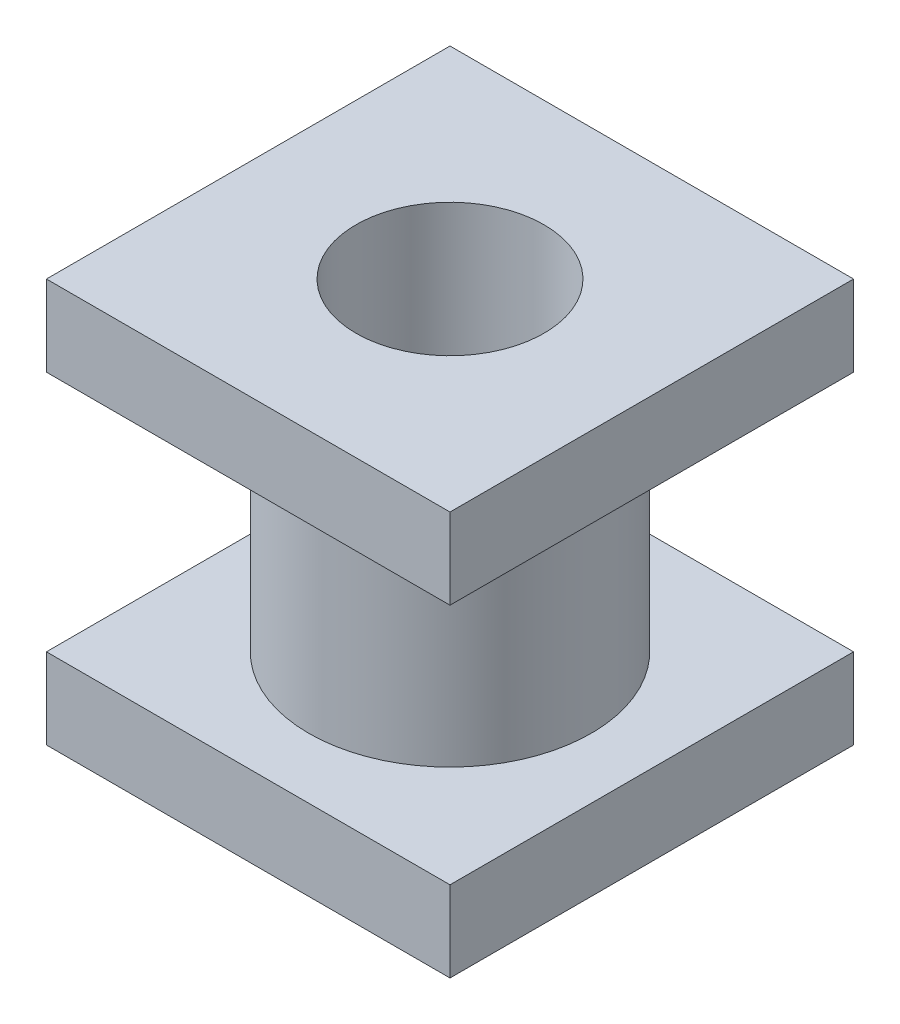
ISO-10303-21;
HEADER;
FILE_DESCRIPTION(('STEP AP214'),'2;1');
FILE_NAME('part.step','',(''),(''),'','','');
FILE_SCHEMA(('AUTOMOTIVE_DESIGN { 1 0 10303 214 1 1 1 1 }'));
ENDSEC;
DATA;
#1=APPLICATION_CONTEXT('core data for automotive mechanical design processes');
#2=APPLICATION_PROTOCOL_DEFINITION('international standard','automotive_design',2000,#1);
#3=PRODUCT_CONTEXT('',#1,'mechanical');
#4=PRODUCT('Part','Part','',(#3));
#5=PRODUCT_RELATED_PRODUCT_CATEGORY('part','',(#4));
#6=PRODUCT_DEFINITION_FORMATION('','',#4);
#7=PRODUCT_DEFINITION_CONTEXT('part definition',#1,'design');
#8=PRODUCT_DEFINITION('design','',#6,#7);
#9=PRODUCT_DEFINITION_SHAPE('','',#8);
#10=(LENGTH_UNIT() NAMED_UNIT(*) SI_UNIT(.MILLI.,.METRE.));
#11=(NAMED_UNIT(*) PLANE_ANGLE_UNIT() SI_UNIT($,.RADIAN.));
#12=(NAMED_UNIT(*) SI_UNIT($,.STERADIAN.) SOLID_ANGLE_UNIT());
#13=UNCERTAINTY_MEASURE_WITH_UNIT(LENGTH_MEASURE(1.E-05),#10,'distance_accuracy_value','');
#14=(GEOMETRIC_REPRESENTATION_CONTEXT(3) GLOBAL_UNCERTAINTY_ASSIGNED_CONTEXT((#13)) GLOBAL_UNIT_ASSIGNED_CONTEXT((#10,
#11,#12)) REPRESENTATION_CONTEXT('',''));
#15=CARTESIAN_POINT('',(0.,0.,0.));
#16=DIRECTION('',(0.,0.,1.));
#17=DIRECTION('',(1.,0.,0.));
#18=AXIS2_PLACEMENT_3D('',#15,#16,#17);
#19=CARTESIAN_POINT('',(0.,2.,0.));
#20=DIRECTION('',(0.,1.,0.));
#21=DIRECTION('',(0.,0.,1.));
#22=AXIS2_PLACEMENT_3D('',#19,#20,#21);
#23=PLANE('',#22);
#24=DIRECTION('',(0.,0.,1.));
#25=VECTOR('',#24,1.);
#26=CARTESIAN_POINT('',(0.,2.,0.));
#27=LINE('',#26,#25);
#28=CARTESIAN_POINT('',(0.,2.,0.));
#29=VERTEX_POINT('',#28);
#30=CARTESIAN_POINT('',(0.,2.,10.));
#31=VERTEX_POINT('',#30);
#32=EDGE_CURVE('E168',#29,#31,#27,.T.);
#33=ORIENTED_EDGE('',*,*,#32,.T.);
#34=DIRECTION('',(1.,0.,0.));
#35=VECTOR('',#34,1.);
#36=CARTESIAN_POINT('',(0.,2.,10.));
#37=LINE('',#36,#35);
#38=CARTESIAN_POINT('',(10.,2.,10.));
#39=VERTEX_POINT('',#38);
#40=EDGE_CURVE('E100',#31,#39,#37,.T.);
#41=ORIENTED_EDGE('',*,*,#40,.T.);
#42=DIRECTION('',(0.,0.,-1.));
#43=VECTOR('',#42,1.);
#44=CARTESIAN_POINT('',(10.,2.,0.));
#45=LINE('',#44,#43);
#46=CARTESIAN_POINT('',(10.,2.,0.));
#47=VERTEX_POINT('',#46);
#48=EDGE_CURVE('E173',#39,#47,#45,.T.);
#49=ORIENTED_EDGE('',*,*,#48,.T.);
#50=DIRECTION('',(-1.,0.,0.));
#51=VECTOR('',#50,1.);
#52=CARTESIAN_POINT('',(0.,2.,0.));
#53=LINE('',#52,#51);
#54=EDGE_CURVE('E69',#47,#29,#53,.T.);
#55=ORIENTED_EDGE('',*,*,#54,.T.);
#56=EDGE_LOOP('',(#33,#41,#49,#55));
#57=FACE_BOUND('',#56,.T.);
#58=CARTESIAN_POINT('',(5.,2.,5.));
#59=DIRECTION('',(0.,1.,0.));
#60=DIRECTION('',(0.,0.,1.));
#61=AXIS2_PLACEMENT_3D('',#58,#59,#60);
#62=CIRCLE('',#61,3.5);
#63=CARTESIAN_POINT('',(5.,2.,8.5));
#64=VERTEX_POINT('',#63);
#65=EDGE_CURVE('E155',#64,#64,#62,.T.);
#66=ORIENTED_EDGE('',*,*,#65,.F.);
#67=EDGE_LOOP('',(#66));
#68=FACE_BOUND('',#67,.T.);
#69=ADVANCED_FACE('F51',(#57,#68),#23,.T.);
#70=CARTESIAN_POINT('',(0.,0.,0.));
#71=DIRECTION('',(0.,1.,0.));
#72=DIRECTION('',(0.,0.,1.));
#73=AXIS2_PLACEMENT_3D('',#70,#71,#72);
#74=PLANE('',#73);
#75=CARTESIAN_POINT('',(5.,0.,5.));
#76=DIRECTION('',(0.,1.,0.));
#77=DIRECTION('',(0.,0.,1.));
#78=AXIS2_PLACEMENT_3D('',#75,#76,#77);
#79=CIRCLE('',#78,2.33044668672168);
#80=CARTESIAN_POINT('',(5.,0.,7.33044668672168));
#81=VERTEX_POINT('',#80);
#82=EDGE_CURVE('E252',#81,#81,#79,.T.);
#83=ORIENTED_EDGE('',*,*,#82,.T.);
#84=EDGE_LOOP('',(#83));
#85=FACE_BOUND('',#84,.T.);
#86=DIRECTION('',(0.,0.,1.));
#87=VECTOR('',#86,1.);
#88=CARTESIAN_POINT('',(0.,0.,0.));
#89=LINE('',#88,#87);
#90=CARTESIAN_POINT('',(0.,0.,0.));
#91=VERTEX_POINT('',#90);
#92=CARTESIAN_POINT('',(0.,0.,10.));
#93=VERTEX_POINT('',#92);
#94=EDGE_CURVE('E161',#91,#93,#89,.T.);
#95=ORIENTED_EDGE('',*,*,#94,.F.);
#96=DIRECTION('',(-1.,0.,0.));
#97=VECTOR('',#96,1.);
#98=CARTESIAN_POINT('',(0.,0.,0.));
#99=LINE('',#98,#97);
#100=CARTESIAN_POINT('',(10.,0.,0.));
#101=VERTEX_POINT('',#100);
#102=EDGE_CURVE('E93',#101,#91,#99,.T.);
#103=ORIENTED_EDGE('',*,*,#102,.F.);
#104=DIRECTION('',(0.,0.,-1.));
#105=VECTOR('',#104,1.);
#106=CARTESIAN_POINT('',(10.,0.,0.));
#107=LINE('',#106,#105);
#108=CARTESIAN_POINT('',(10.,0.,10.));
#109=VERTEX_POINT('',#108);
#110=EDGE_CURVE('E87',#109,#101,#107,.T.);
#111=ORIENTED_EDGE('',*,*,#110,.F.);
#112=DIRECTION('',(1.,0.,0.));
#113=VECTOR('',#112,1.);
#114=CARTESIAN_POINT('',(0.,0.,10.));
#115=LINE('',#114,#113);
#116=EDGE_CURVE('E182',#93,#109,#115,.T.);
#117=ORIENTED_EDGE('',*,*,#116,.F.);
#118=EDGE_LOOP('',(#95,#103,#111,#117));
#119=FACE_BOUND('',#118,.T.);
#120=ADVANCED_FACE('F200',(#85,#119),#74,.F.);
#121=CARTESIAN_POINT('',(0.,2.,0.));
#122=DIRECTION('',(1.,0.,0.));
#123=DIRECTION('',(0.,0.,-1.));
#124=AXIS2_PLACEMENT_3D('',#121,#122,#123);
#125=PLANE('',#124);
#126=ORIENTED_EDGE('',*,*,#94,.T.);
#127=DIRECTION('',(0.,-1.,0.));
#128=VECTOR('',#127,1.);
#129=CARTESIAN_POINT('',(0.,2.,10.));
#130=LINE('',#129,#128);
#131=EDGE_CURVE('E11',#31,#93,#130,.T.);
#132=ORIENTED_EDGE('',*,*,#131,.F.);
#133=ORIENTED_EDGE('',*,*,#32,.F.);
#134=DIRECTION('',(0.,-1.,0.));
#135=VECTOR('',#134,1.);
#136=CARTESIAN_POINT('',(0.,2.,0.));
#137=LINE('',#136,#135);
#138=EDGE_CURVE('E178',#29,#91,#137,.T.);
#139=ORIENTED_EDGE('',*,*,#138,.T.);
#140=EDGE_LOOP('',(#126,#132,#133,#139));
#141=FACE_BOUND('',#140,.T.);
#142=ADVANCED_FACE('F53',(#141),#125,.F.);
#143=CARTESIAN_POINT('',(0.,2.,10.));
#144=DIRECTION('',(0.,0.,-1.));
#145=DIRECTION('',(-1.,0.,0.));
#146=AXIS2_PLACEMENT_3D('',#143,#144,#145);
#147=PLANE('',#146);
#148=ORIENTED_EDGE('',*,*,#116,.T.);
#149=DIRECTION('',(0.,-1.,0.));
#150=VECTOR('',#149,1.);
#151=CARTESIAN_POINT('',(10.,2.,10.));
#152=LINE('',#151,#150);
#153=EDGE_CURVE('E61',#39,#109,#152,.T.);
#154=ORIENTED_EDGE('',*,*,#153,.F.);
#155=ORIENTED_EDGE('',*,*,#40,.F.);
#156=ORIENTED_EDGE('',*,*,#131,.T.);
#157=EDGE_LOOP('',(#148,#154,#155,#156));
#158=FACE_BOUND('',#157,.T.);
#159=ADVANCED_FACE('F214',(#158),#147,.F.);
#160=CARTESIAN_POINT('',(10.,2.,0.));
#161=DIRECTION('',(-1.,0.,0.));
#162=DIRECTION('',(0.,0.,1.));
#163=AXIS2_PLACEMENT_3D('',#160,#161,#162);
#164=PLANE('',#163);
#165=ORIENTED_EDGE('',*,*,#110,.T.);
#166=DIRECTION('',(0.,-1.,0.));
#167=VECTOR('',#166,1.);
#168=CARTESIAN_POINT('',(10.,2.,0.));
#169=LINE('',#168,#167);
#170=EDGE_CURVE('E191',#47,#101,#169,.T.);
#171=ORIENTED_EDGE('',*,*,#170,.F.);
#172=ORIENTED_EDGE('',*,*,#48,.F.);
#173=ORIENTED_EDGE('',*,*,#153,.T.);
#174=EDGE_LOOP('',(#165,#171,#172,#173));
#175=FACE_BOUND('',#174,.T.);
#176=ADVANCED_FACE('F197',(#175),#164,.F.);
#177=CARTESIAN_POINT('',(0.,2.,0.));
#178=DIRECTION('',(0.,0.,1.));
#179=DIRECTION('',(1.,0.,0.));
#180=AXIS2_PLACEMENT_3D('',#177,#178,#179);
#181=PLANE('',#180);
#182=ORIENTED_EDGE('',*,*,#102,.T.);
#183=ORIENTED_EDGE('',*,*,#138,.F.);
#184=ORIENTED_EDGE('',*,*,#54,.F.);
#185=ORIENTED_EDGE('',*,*,#170,.T.);
#186=EDGE_LOOP('',(#182,#183,#184,#185));
#187=FACE_BOUND('',#186,.T.);
#188=ADVANCED_FACE('F204',(#187),#181,.F.);
#189=CARTESIAN_POINT('',(5.,10.,5.));
#190=DIRECTION('',(0.,-1.,0.));
#191=DIRECTION('',(0.,0.,-1.));
#192=AXIS2_PLACEMENT_3D('',#189,#190,#191);
#193=CYLINDRICAL_SURFACE('',#192,3.5);
#194=CARTESIAN_POINT('',(5.,8.,5.));
#195=DIRECTION('',(0.,1.,0.));
#196=DIRECTION('',(0.,0.,1.));
#197=AXIS2_PLACEMENT_3D('',#194,#195,#196);
#198=CIRCLE('',#197,3.5);
#199=CARTESIAN_POINT('',(5.,8.,8.5));
#200=VERTEX_POINT('',#199);
#201=EDGE_CURVE('E259',#200,#200,#198,.T.);
#202=ORIENTED_EDGE('',*,*,#201,.F.);
#203=EDGE_LOOP('',(#202));
#204=FACE_BOUND('',#203,.T.);
#205=ORIENTED_EDGE('',*,*,#65,.T.);
#206=EDGE_LOOP('',(#205));
#207=FACE_BOUND('',#206,.T.);
#208=ADVANCED_FACE('F206',(#204,#207),#193,.T.);
#209=CARTESIAN_POINT('',(10.,8.,0.));
#210=DIRECTION('',(-1.,0.,0.));
#211=DIRECTION('',(0.,0.,1.));
#212=AXIS2_PLACEMENT_3D('',#209,#210,#211);
#213=PLANE('',#212);
#214=DIRECTION('',(0.,0.,1.));
#215=VECTOR('',#214,1.);
#216=CARTESIAN_POINT('',(10.,10.,0.));
#217=LINE('',#216,#215);
#218=CARTESIAN_POINT('',(10.,10.,0.));
#219=VERTEX_POINT('',#218);
#220=CARTESIAN_POINT('',(10.,10.,10.));
#221=VERTEX_POINT('',#220);
#222=EDGE_CURVE('E153',#219,#221,#217,.T.);
#223=ORIENTED_EDGE('',*,*,#222,.T.);
#224=DIRECTION('',(0.,1.,0.));
#225=VECTOR('',#224,1.);
#226=CARTESIAN_POINT('',(10.,8.,10.));
#227=LINE('',#226,#225);
#228=CARTESIAN_POINT('',(10.,8.,10.));
#229=VERTEX_POINT('',#228);
#230=EDGE_CURVE('E131',#229,#221,#227,.T.);
#231=ORIENTED_EDGE('',*,*,#230,.F.);
#232=DIRECTION('',(0.,0.,1.));
#233=VECTOR('',#232,1.);
#234=CARTESIAN_POINT('',(10.,8.,0.));
#235=LINE('',#234,#233);
#236=CARTESIAN_POINT('',(10.,8.,0.));
#237=VERTEX_POINT('',#236);
#238=EDGE_CURVE('E139',#237,#229,#235,.T.);
#239=ORIENTED_EDGE('',*,*,#238,.F.);
#240=DIRECTION('',(0.,1.,0.));
#241=VECTOR('',#240,1.);
#242=CARTESIAN_POINT('',(10.,8.,0.));
#243=LINE('',#242,#241);
#244=EDGE_CURVE('E269',#237,#219,#243,.T.);
#245=ORIENTED_EDGE('',*,*,#244,.T.);
#246=EDGE_LOOP('',(#223,#231,#239,#245));
#247=FACE_BOUND('',#246,.T.);
#248=ADVANCED_FACE('F151',(#247),#213,.F.);
#249=CARTESIAN_POINT('',(0.,8.,10.));
#250=DIRECTION('',(0.,0.,-1.));
#251=DIRECTION('',(-1.,0.,0.));
#252=AXIS2_PLACEMENT_3D('',#249,#250,#251);
#253=PLANE('',#252);
#254=DIRECTION('',(-1.,0.,0.));
#255=VECTOR('',#254,1.);
#256=CARTESIAN_POINT('',(0.,10.,10.));
#257=LINE('',#256,#255);
#258=CARTESIAN_POINT('',(0.,10.,10.));
#259=VERTEX_POINT('',#258);
#260=EDGE_CURVE('E272',#221,#259,#257,.T.);
#261=ORIENTED_EDGE('',*,*,#260,.T.);
#262=DIRECTION('',(0.,1.,0.));
#263=VECTOR('',#262,1.);
#264=CARTESIAN_POINT('',(0.,8.,10.));
#265=LINE('',#264,#263);
#266=CARTESIAN_POINT('',(0.,8.,10.));
#267=VERTEX_POINT('',#266);
#268=EDGE_CURVE('E134',#267,#259,#265,.T.);
#269=ORIENTED_EDGE('',*,*,#268,.F.);
#270=DIRECTION('',(-1.,0.,0.));
#271=VECTOR('',#270,1.);
#272=CARTESIAN_POINT('',(0.,8.,10.));
#273=LINE('',#272,#271);
#274=EDGE_CURVE('E127',#229,#267,#273,.T.);
#275=ORIENTED_EDGE('',*,*,#274,.F.);
#276=ORIENTED_EDGE('',*,*,#230,.T.);
#277=EDGE_LOOP('',(#261,#269,#275,#276));
#278=FACE_BOUND('',#277,.T.);
#279=ADVANCED_FACE('F129',(#278),#253,.F.);
#280=CARTESIAN_POINT('',(0.,8.,0.));
#281=DIRECTION('',(1.,0.,0.));
#282=DIRECTION('',(0.,0.,-1.));
#283=AXIS2_PLACEMENT_3D('',#280,#281,#282);
#284=PLANE('',#283);
#285=DIRECTION('',(0.,0.,-1.));
#286=VECTOR('',#285,1.);
#287=CARTESIAN_POINT('',(0.,10.,0.));
#288=LINE('',#287,#286);
#289=CARTESIAN_POINT('',(0.,10.,0.));
#290=VERTEX_POINT('',#289);
#291=EDGE_CURVE('E275',#259,#290,#288,.T.);
#292=ORIENTED_EDGE('',*,*,#291,.T.);
#293=DIRECTION('',(0.,1.,0.));
#294=VECTOR('',#293,1.);
#295=CARTESIAN_POINT('',(0.,8.,0.));
#296=LINE('',#295,#294);
#297=CARTESIAN_POINT('',(0.,8.,0.));
#298=VERTEX_POINT('',#297);
#299=EDGE_CURVE('E164',#298,#290,#296,.T.);
#300=ORIENTED_EDGE('',*,*,#299,.F.);
#301=DIRECTION('',(0.,0.,-1.));
#302=VECTOR('',#301,1.);
#303=CARTESIAN_POINT('',(0.,8.,0.));
#304=LINE('',#303,#302);
#305=EDGE_CURVE('E138',#267,#298,#304,.T.);
#306=ORIENTED_EDGE('',*,*,#305,.F.);
#307=ORIENTED_EDGE('',*,*,#268,.T.);
#308=EDGE_LOOP('',(#292,#300,#306,#307));
#309=FACE_BOUND('',#308,.T.);
#310=ADVANCED_FACE('F234',(#309),#284,.F.);
#311=CARTESIAN_POINT('',(0.,8.,0.));
#312=DIRECTION('',(0.,0.,1.));
#313=DIRECTION('',(1.,0.,0.));
#314=AXIS2_PLACEMENT_3D('',#311,#312,#313);
#315=PLANE('',#314);
#316=DIRECTION('',(1.,0.,0.));
#317=VECTOR('',#316,1.);
#318=CARTESIAN_POINT('',(0.,10.,0.));
#319=LINE('',#318,#317);
#320=EDGE_CURVE('E149',#290,#219,#319,.T.);
#321=ORIENTED_EDGE('',*,*,#320,.T.);
#322=ORIENTED_EDGE('',*,*,#244,.F.);
#323=DIRECTION('',(1.,0.,0.));
#324=VECTOR('',#323,1.);
#325=CARTESIAN_POINT('',(0.,8.,0.));
#326=LINE('',#325,#324);
#327=EDGE_CURVE('E144',#298,#237,#326,.T.);
#328=ORIENTED_EDGE('',*,*,#327,.F.);
#329=ORIENTED_EDGE('',*,*,#299,.T.);
#330=EDGE_LOOP('',(#321,#322,#328,#329));
#331=FACE_BOUND('',#330,.T.);
#332=ADVANCED_FACE('F237',(#331),#315,.F.);
#333=CARTESIAN_POINT('',(0.,8.,0.));
#334=DIRECTION('',(0.,-1.,0.));
#335=DIRECTION('',(0.,0.,-1.));
#336=AXIS2_PLACEMENT_3D('',#333,#334,#335);
#337=PLANE('',#336);
#338=ORIENTED_EDGE('',*,*,#201,.T.);
#339=EDGE_LOOP('',(#338));
#340=FACE_BOUND('',#339,.T.);
#341=ORIENTED_EDGE('',*,*,#238,.T.);
#342=ORIENTED_EDGE('',*,*,#274,.T.);
#343=ORIENTED_EDGE('',*,*,#305,.T.);
#344=ORIENTED_EDGE('',*,*,#327,.T.);
#345=EDGE_LOOP('',(#341,#342,#343,#344));
#346=FACE_BOUND('',#345,.T.);
#347=ADVANCED_FACE('F142',(#340,#346),#337,.T.);
#348=CARTESIAN_POINT('',(0.,10.,0.));
#349=DIRECTION('',(0.,1.,0.));
#350=DIRECTION('',(0.,0.,1.));
#351=AXIS2_PLACEMENT_3D('',#348,#349,#350);
#352=PLANE('',#351);
#353=CARTESIAN_POINT('',(5.,10.,5.));
#354=DIRECTION('',(0.,1.,0.));
#355=DIRECTION('',(0.,0.,1.));
#356=AXIS2_PLACEMENT_3D('',#353,#354,#355);
#357=CIRCLE('',#356,2.33044668672168);
#358=CARTESIAN_POINT('',(5.,10.,7.33044668672168));
#359=VERTEX_POINT('',#358);
#360=EDGE_CURVE('E255',#359,#359,#357,.T.);
#361=ORIENTED_EDGE('',*,*,#360,.F.);
#362=EDGE_LOOP('',(#361));
#363=FACE_BOUND('',#362,.T.);
#364=ORIENTED_EDGE('',*,*,#222,.F.);
#365=ORIENTED_EDGE('',*,*,#320,.F.);
#366=ORIENTED_EDGE('',*,*,#291,.F.);
#367=ORIENTED_EDGE('',*,*,#260,.F.);
#368=EDGE_LOOP('',(#364,#365,#366,#367));
#369=FACE_BOUND('',#368,.T.);
#370=ADVANCED_FACE('F225',(#363,#369),#352,.T.);
#371=CARTESIAN_POINT('',(5.,0.,5.));
#372=DIRECTION('',(0.,1.,0.));
#373=DIRECTION('',(0.,0.,1.));
#374=AXIS2_PLACEMENT_3D('',#371,#372,#373);
#375=CYLINDRICAL_SURFACE('',#374,2.33044668672168);
#376=ORIENTED_EDGE('',*,*,#82,.F.);
#377=EDGE_LOOP('',(#376));
#378=FACE_BOUND('',#377,.T.);
#379=ORIENTED_EDGE('',*,*,#360,.T.);
#380=EDGE_LOOP('',(#379));
#381=FACE_BOUND('',#380,.T.);
#382=ADVANCED_FACE('F228',(#378,#381),#375,.F.);
#383=CLOSED_SHELL('',(#69,#120,#142,#159,#176,#188,#208,#248,#279,#310,#332,#347,#370,#382));
#384=MANIFOLD_SOLID_BREP('B2',#383);
#385=ADVANCED_BREP_SHAPE_REPRESENTATION('',(#18,#384),#14);
#386=SHAPE_DEFINITION_REPRESENTATION(#9,#385);
ENDSEC;
END-ISO-10303-21;
